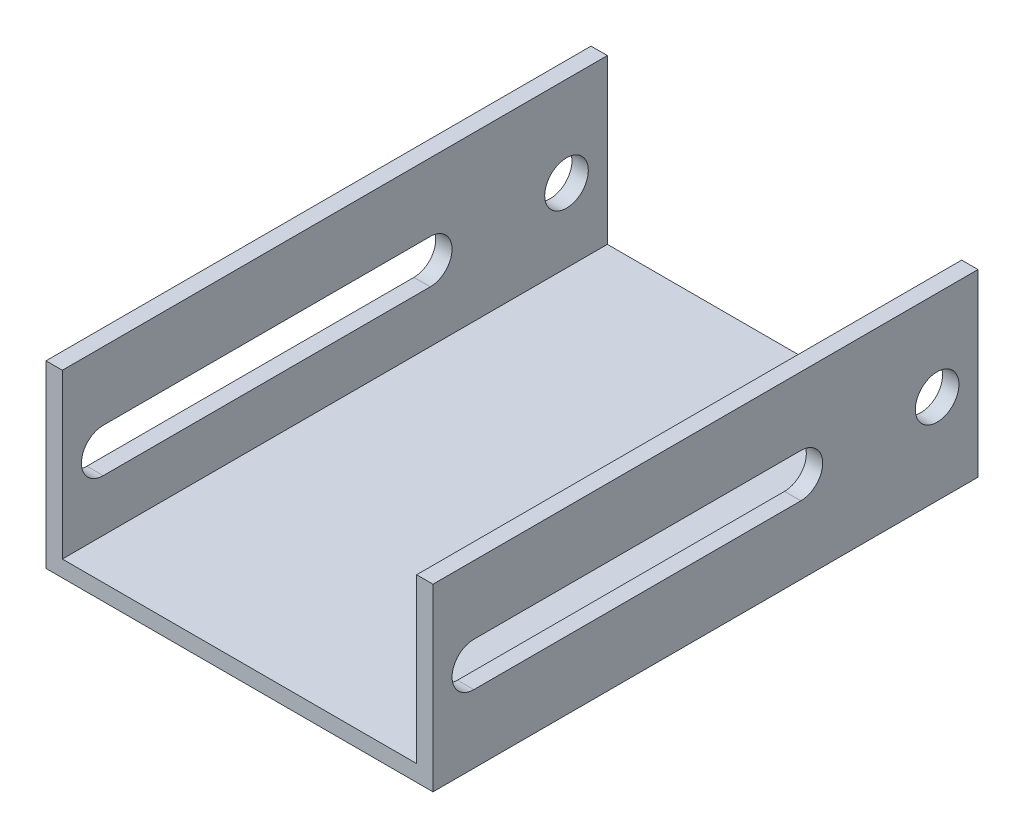
ISO-10303-21;
HEADER;
FILE_DESCRIPTION(('STEP AP214'),'2;1');
FILE_NAME('part.step','',(''),(''),'','','');
FILE_SCHEMA(('AUTOMOTIVE_DESIGN { 1 0 10303 214 1 1 1 1 }'));
ENDSEC;
DATA;
#1=APPLICATION_CONTEXT('core data for automotive mechanical design processes');
#2=APPLICATION_PROTOCOL_DEFINITION('international standard','automotive_design',2000,#1);
#3=PRODUCT_CONTEXT('',#1,'mechanical');
#4=PRODUCT('Part','Part','',(#3));
#5=PRODUCT_RELATED_PRODUCT_CATEGORY('part','',(#4));
#6=PRODUCT_DEFINITION_FORMATION('','',#4);
#7=PRODUCT_DEFINITION_CONTEXT('part definition',#1,'design');
#8=PRODUCT_DEFINITION('design','',#6,#7);
#9=PRODUCT_DEFINITION_SHAPE('','',#8);
#10=(LENGTH_UNIT() NAMED_UNIT(*) SI_UNIT(.MILLI.,.METRE.));
#11=(NAMED_UNIT(*) PLANE_ANGLE_UNIT() SI_UNIT($,.RADIAN.));
#12=(NAMED_UNIT(*) SI_UNIT($,.STERADIAN.) SOLID_ANGLE_UNIT());
#13=UNCERTAINTY_MEASURE_WITH_UNIT(LENGTH_MEASURE(1.E-05),#10,'distance_accuracy_value','');
#14=(GEOMETRIC_REPRESENTATION_CONTEXT(3) GLOBAL_UNCERTAINTY_ASSIGNED_CONTEXT((#13)) GLOBAL_UNIT_ASSIGNED_CONTEXT((#10,
#11,#12)) REPRESENTATION_CONTEXT('',''));
#15=CARTESIAN_POINT('',(0.,0.,0.));
#16=DIRECTION('',(0.,0.,1.));
#17=DIRECTION('',(1.,0.,0.));
#18=AXIS2_PLACEMENT_3D('',#15,#16,#17);
#19=CARTESIAN_POINT('',(0.,3.,0.));
#20=DIRECTION('',(0.,-1.,0.));
#21=DIRECTION('',(0.,0.,-1.));
#22=AXIS2_PLACEMENT_3D('',#19,#20,#21);
#23=PLANE('',#22);
#24=DIRECTION('',(0.,0.,1.));
#25=VECTOR('',#24,1.);
#26=CARTESIAN_POINT('',(32.5,3.,50.));
#27=LINE('',#26,#25);
#28=CARTESIAN_POINT('',(32.5,3.,-50.));
#29=VERTEX_POINT('',#28);
#30=CARTESIAN_POINT('',(32.5,3.,50.));
#31=VERTEX_POINT('',#30);
#32=EDGE_CURVE('E210',#29,#31,#27,.T.);
#33=ORIENTED_EDGE('',*,*,#32,.F.);
#34=DIRECTION('',(-1.,0.,0.));
#35=VECTOR('',#34,1.);
#36=CARTESIAN_POINT('',(-35.5,3.,-50.));
#37=LINE('',#36,#35);
#38=CARTESIAN_POINT('',(-32.5,3.,-50.));
#39=VERTEX_POINT('',#38);
#40=EDGE_CURVE('E261',#29,#39,#37,.T.);
#41=ORIENTED_EDGE('',*,*,#40,.T.);
#42=DIRECTION('',(0.,0.,-1.));
#43=VECTOR('',#42,1.);
#44=CARTESIAN_POINT('',(-32.5,3.,-50.));
#45=LINE('',#44,#43);
#46=CARTESIAN_POINT('',(-32.5,3.,50.));
#47=VERTEX_POINT('',#46);
#48=EDGE_CURVE('E229',#47,#39,#45,.T.);
#49=ORIENTED_EDGE('',*,*,#48,.F.);
#50=DIRECTION('',(1.,0.,0.));
#51=VECTOR('',#50,1.);
#52=CARTESIAN_POINT('',(-35.5,3.,50.));
#53=LINE('',#52,#51);
#54=EDGE_CURVE('E249',#47,#31,#53,.T.);
#55=ORIENTED_EDGE('',*,*,#54,.T.);
#56=EDGE_LOOP('',(#33,#41,#49,#55));
#57=FACE_BOUND('',#56,.T.);
#58=ADVANCED_FACE('F35',(#57),#23,.F.);
#59=CARTESIAN_POINT('',(35.5,3.,50.));
#60=DIRECTION('',(-1.,0.,0.));
#61=DIRECTION('',(0.,0.,1.));
#62=AXIS2_PLACEMENT_3D('',#59,#60,#61);
#63=PLANE('',#62);
#64=DIRECTION('',(0.,0.,1.));
#65=VECTOR('',#64,1.);
#66=CARTESIAN_POINT('',(35.5,20.5,42.5));
#67=LINE('',#66,#65);
#68=CARTESIAN_POINT('',(35.5,20.5,-17.5));
#69=VERTEX_POINT('',#68);
#70=CARTESIAN_POINT('',(35.5,20.5,42.5));
#71=VERTEX_POINT('',#70);
#72=EDGE_CURVE('E163',#69,#71,#67,.T.);
#73=ORIENTED_EDGE('',*,*,#72,.F.);
#74=CARTESIAN_POINT('',(35.5,16.5,-17.5));
#75=DIRECTION('',(1.,0.,0.));
#76=DIRECTION('',(0.,0.,-1.));
#77=AXIS2_PLACEMENT_3D('',#74,#75,#76);
#78=CIRCLE('',#77,4.);
#79=CARTESIAN_POINT('',(35.5,12.5,-17.5));
#80=VERTEX_POINT('',#79);
#81=EDGE_CURVE('E50',#80,#69,#78,.T.);
#82=ORIENTED_EDGE('',*,*,#81,.F.);
#83=DIRECTION('',(0.,0.,-1.));
#84=VECTOR('',#83,1.);
#85=CARTESIAN_POINT('',(35.5,12.5,42.5));
#86=LINE('',#85,#84);
#87=CARTESIAN_POINT('',(35.5,12.5,42.5));
#88=VERTEX_POINT('',#87);
#89=EDGE_CURVE('E170',#88,#80,#86,.T.);
#90=ORIENTED_EDGE('',*,*,#89,.F.);
#91=CARTESIAN_POINT('',(35.5,16.5,42.5));
#92=DIRECTION('',(1.,0.,0.));
#93=DIRECTION('',(0.,0.,-1.));
#94=AXIS2_PLACEMENT_3D('',#91,#92,#93);
#95=CIRCLE('',#94,4.00000000000001);
#96=EDGE_CURVE('E154',#71,#88,#95,.T.);
#97=ORIENTED_EDGE('',*,*,#96,.F.);
#98=EDGE_LOOP('',(#73,#82,#90,#97));
#99=FACE_BOUND('',#98,.T.);
#100=CARTESIAN_POINT('',(35.5,16.5,-42.5));
#101=DIRECTION('',(1.,0.,0.));
#102=DIRECTION('',(0.,0.,-1.));
#103=AXIS2_PLACEMENT_3D('',#100,#101,#102);
#104=CIRCLE('',#103,4.00000000000001);
#105=CARTESIAN_POINT('',(35.5,16.5,-46.5));
#106=VERTEX_POINT('',#105);
#107=EDGE_CURVE('E200',#106,#106,#104,.T.);
#108=ORIENTED_EDGE('',*,*,#107,.F.);
#109=EDGE_LOOP('',(#108));
#110=FACE_BOUND('',#109,.T.);
#111=DIRECTION('',(0.,0.,-1.));
#112=VECTOR('',#111,1.);
#113=CARTESIAN_POINT('',(35.5,0.,50.));
#114=LINE('',#113,#112);
#115=CARTESIAN_POINT('',(35.5,0.,50.));
#116=VERTEX_POINT('',#115);
#117=CARTESIAN_POINT('',(35.5,0.,-50.));
#118=VERTEX_POINT('',#117);
#119=EDGE_CURVE('E258',#116,#118,#114,.T.);
#120=ORIENTED_EDGE('',*,*,#119,.T.);
#121=DIRECTION('',(0.,-1.,0.));
#122=VECTOR('',#121,1.);
#123=CARTESIAN_POINT('',(35.5,3.,-50.));
#124=LINE('',#123,#122);
#125=CARTESIAN_POINT('',(35.5,33.,-50.));
#126=VERTEX_POINT('',#125);
#127=EDGE_CURVE('E268',#126,#118,#124,.T.);
#128=ORIENTED_EDGE('',*,*,#127,.F.);
#129=DIRECTION('',(0.,0.,-1.));
#130=VECTOR('',#129,1.);
#131=CARTESIAN_POINT('',(35.5,33.,50.));
#132=LINE('',#131,#130);
#133=CARTESIAN_POINT('',(35.5,33.,50.));
#134=VERTEX_POINT('',#133);
#135=EDGE_CURVE('E211',#134,#126,#132,.T.);
#136=ORIENTED_EDGE('',*,*,#135,.F.);
#137=DIRECTION('',(0.,-1.,0.));
#138=VECTOR('',#137,1.);
#139=CARTESIAN_POINT('',(35.5,3.,50.));
#140=LINE('',#139,#138);
#141=EDGE_CURVE('E336',#134,#116,#140,.T.);
#142=ORIENTED_EDGE('',*,*,#141,.T.);
#143=EDGE_LOOP('',(#120,#128,#136,#142));
#144=FACE_BOUND('',#143,.T.);
#145=ADVANCED_FACE('F37',(#99,#110,#144),#63,.F.);
#146=CARTESIAN_POINT('',(-35.5,3.,-50.));
#147=DIRECTION('',(0.,0.,1.));
#148=DIRECTION('',(1.,0.,0.));
#149=AXIS2_PLACEMENT_3D('',#146,#147,#148);
#150=PLANE('',#149);
#151=DIRECTION('',(-1.,0.,0.));
#152=VECTOR('',#151,1.);
#153=CARTESIAN_POINT('',(-35.5,0.,-50.));
#154=LINE('',#153,#152);
#155=CARTESIAN_POINT('',(-35.5,0.,-50.));
#156=VERTEX_POINT('',#155);
#157=EDGE_CURVE('E316',#118,#156,#154,.T.);
#158=ORIENTED_EDGE('',*,*,#157,.T.);
#159=DIRECTION('',(0.,-1.,0.));
#160=VECTOR('',#159,1.);
#161=CARTESIAN_POINT('',(-35.5,3.,-50.));
#162=LINE('',#161,#160);
#163=CARTESIAN_POINT('',(-35.5,33.,-50.));
#164=VERTEX_POINT('',#163);
#165=EDGE_CURVE('E319',#164,#156,#162,.T.);
#166=ORIENTED_EDGE('',*,*,#165,.F.);
#167=DIRECTION('',(-1.,0.,0.));
#168=VECTOR('',#167,1.);
#169=CARTESIAN_POINT('',(-35.5,33.,-50.));
#170=LINE('',#169,#168);
#171=CARTESIAN_POINT('',(-32.5,33.,-50.));
#172=VERTEX_POINT('',#171);
#173=EDGE_CURVE('E237',#172,#164,#170,.T.);
#174=ORIENTED_EDGE('',*,*,#173,.F.);
#175=DIRECTION('',(0.,-1.,0.));
#176=VECTOR('',#175,1.);
#177=CARTESIAN_POINT('',(-32.5,33.,-50.));
#178=LINE('',#177,#176);
#179=EDGE_CURVE('E240',#172,#39,#178,.T.);
#180=ORIENTED_EDGE('',*,*,#179,.T.);
#181=ORIENTED_EDGE('',*,*,#40,.F.);
#182=DIRECTION('',(0.,-1.,0.));
#183=VECTOR('',#182,1.);
#184=CARTESIAN_POINT('',(32.5,33.,-50.));
#185=LINE('',#184,#183);
#186=CARTESIAN_POINT('',(32.5,33.,-50.));
#187=VERTEX_POINT('',#186);
#188=EDGE_CURVE('E226',#187,#29,#185,.T.);
#189=ORIENTED_EDGE('',*,*,#188,.F.);
#190=DIRECTION('',(-1.,0.,0.));
#191=VECTOR('',#190,1.);
#192=CARTESIAN_POINT('',(35.5,33.,-50.));
#193=LINE('',#192,#191);
#194=EDGE_CURVE('E214',#126,#187,#193,.T.);
#195=ORIENTED_EDGE('',*,*,#194,.F.);
#196=ORIENTED_EDGE('',*,*,#127,.T.);
#197=EDGE_LOOP('',(#158,#166,#174,#180,#181,#189,#195,#196));
#198=FACE_BOUND('',#197,.T.);
#199=ADVANCED_FACE('F295',(#198),#150,.F.);
#200=CARTESIAN_POINT('',(-35.5,3.,50.));
#201=DIRECTION('',(1.,0.,0.));
#202=DIRECTION('',(0.,0.,-1.));
#203=AXIS2_PLACEMENT_3D('',#200,#201,#202);
#204=PLANE('',#203);
#205=DIRECTION('',(0.,0.,1.));
#206=VECTOR('',#205,1.);
#207=CARTESIAN_POINT('',(-35.5,12.5,42.5));
#208=LINE('',#207,#206);
#209=CARTESIAN_POINT('',(-35.5,12.5,-17.5));
#210=VERTEX_POINT('',#209);
#211=CARTESIAN_POINT('',(-35.5,12.5,42.5));
#212=VERTEX_POINT('',#211);
#213=EDGE_CURVE('E405',#210,#212,#208,.T.);
#214=ORIENTED_EDGE('',*,*,#213,.F.);
#215=CARTESIAN_POINT('',(-35.5,16.5,-17.5));
#216=DIRECTION('',(1.,0.,0.));
#217=DIRECTION('',(0.,0.,-1.));
#218=AXIS2_PLACEMENT_3D('',#215,#216,#217);
#219=CIRCLE('',#218,4.);
#220=CARTESIAN_POINT('',(-35.5,20.5,-17.5));
#221=VERTEX_POINT('',#220);
#222=EDGE_CURVE('E188',#221,#210,#219,.F.);
#223=ORIENTED_EDGE('',*,*,#222,.F.);
#224=DIRECTION('',(0.,0.,-1.));
#225=VECTOR('',#224,1.);
#226=CARTESIAN_POINT('',(-35.5,20.5,42.5));
#227=LINE('',#226,#225);
#228=CARTESIAN_POINT('',(-35.5,20.5,42.5));
#229=VERTEX_POINT('',#228);
#230=EDGE_CURVE('E185',#229,#221,#227,.T.);
#231=ORIENTED_EDGE('',*,*,#230,.F.);
#232=CARTESIAN_POINT('',(-35.5,16.5,42.5));
#233=DIRECTION('',(1.,0.,0.));
#234=DIRECTION('',(0.,0.,-1.));
#235=AXIS2_PLACEMENT_3D('',#232,#233,#234);
#236=CIRCLE('',#235,4.00000000000001);
#237=EDGE_CURVE('E178',#212,#229,#236,.F.);
#238=ORIENTED_EDGE('',*,*,#237,.F.);
#239=EDGE_LOOP('',(#214,#223,#231,#238));
#240=FACE_BOUND('',#239,.T.);
#241=CARTESIAN_POINT('',(-35.5,16.5,-42.5));
#242=DIRECTION('',(1.,0.,0.));
#243=DIRECTION('',(0.,0.,-1.));
#244=AXIS2_PLACEMENT_3D('',#241,#242,#243);
#245=CIRCLE('',#244,4.00000000000001);
#246=CARTESIAN_POINT('',(-35.5,16.5,-46.5));
#247=VERTEX_POINT('',#246);
#248=EDGE_CURVE('E203',#247,#247,#245,.F.);
#249=ORIENTED_EDGE('',*,*,#248,.F.);
#250=EDGE_LOOP('',(#249));
#251=FACE_BOUND('',#250,.T.);
#252=DIRECTION('',(0.,0.,1.));
#253=VECTOR('',#252,1.);
#254=CARTESIAN_POINT('',(-35.5,0.,50.));
#255=LINE('',#254,#253);
#256=CARTESIAN_POINT('',(-35.5,0.,50.));
#257=VERTEX_POINT('',#256);
#258=EDGE_CURVE('E324',#156,#257,#255,.T.);
#259=ORIENTED_EDGE('',*,*,#258,.T.);
#260=DIRECTION('',(0.,-1.,0.));
#261=VECTOR('',#260,1.);
#262=CARTESIAN_POINT('',(-35.5,3.,50.));
#263=LINE('',#262,#261);
#264=CARTESIAN_POINT('',(-35.5,33.,50.));
#265=VERTEX_POINT('',#264);
#266=EDGE_CURVE('E329',#265,#257,#263,.T.);
#267=ORIENTED_EDGE('',*,*,#266,.F.);
#268=DIRECTION('',(0.,0.,1.));
#269=VECTOR('',#268,1.);
#270=CARTESIAN_POINT('',(-35.5,33.,-50.));
#271=LINE('',#270,#269);
#272=EDGE_CURVE('E230',#164,#265,#271,.T.);
#273=ORIENTED_EDGE('',*,*,#272,.F.);
#274=ORIENTED_EDGE('',*,*,#165,.T.);
#275=EDGE_LOOP('',(#259,#267,#273,#274));
#276=FACE_BOUND('',#275,.T.);
#277=ADVANCED_FACE('F307',(#240,#251,#276),#204,.F.);
#278=CARTESIAN_POINT('',(-35.5,3.,50.));
#279=DIRECTION('',(0.,0.,-1.));
#280=DIRECTION('',(-1.,0.,0.));
#281=AXIS2_PLACEMENT_3D('',#278,#279,#280);
#282=PLANE('',#281);
#283=DIRECTION('',(1.,0.,0.));
#284=VECTOR('',#283,1.);
#285=CARTESIAN_POINT('',(-35.5,0.,50.));
#286=LINE('',#285,#284);
#287=EDGE_CURVE('E263',#257,#116,#286,.T.);
#288=ORIENTED_EDGE('',*,*,#287,.T.);
#289=ORIENTED_EDGE('',*,*,#141,.F.);
#290=DIRECTION('',(1.,0.,0.));
#291=VECTOR('',#290,1.);
#292=CARTESIAN_POINT('',(35.5,33.,50.));
#293=LINE('',#292,#291);
#294=CARTESIAN_POINT('',(32.5,33.,50.));
#295=VERTEX_POINT('',#294);
#296=EDGE_CURVE('E218',#295,#134,#293,.T.);
#297=ORIENTED_EDGE('',*,*,#296,.F.);
#298=DIRECTION('',(0.,-1.,0.));
#299=VECTOR('',#298,1.);
#300=CARTESIAN_POINT('',(32.5,33.,50.));
#301=LINE('',#300,#299);
#302=EDGE_CURVE('E221',#295,#31,#301,.T.);
#303=ORIENTED_EDGE('',*,*,#302,.T.);
#304=ORIENTED_EDGE('',*,*,#54,.F.);
#305=DIRECTION('',(0.,-1.,0.));
#306=VECTOR('',#305,1.);
#307=CARTESIAN_POINT('',(-32.5,33.,50.));
#308=LINE('',#307,#306);
#309=CARTESIAN_POINT('',(-32.5,33.,50.));
#310=VERTEX_POINT('',#309);
#311=EDGE_CURVE('E253',#310,#47,#308,.T.);
#312=ORIENTED_EDGE('',*,*,#311,.F.);
#313=DIRECTION('',(1.,0.,0.));
#314=VECTOR('',#313,1.);
#315=CARTESIAN_POINT('',(-35.5,33.,50.));
#316=LINE('',#315,#314);
#317=EDGE_CURVE('E233',#265,#310,#316,.T.);
#318=ORIENTED_EDGE('',*,*,#317,.F.);
#319=ORIENTED_EDGE('',*,*,#266,.T.);
#320=EDGE_LOOP('',(#288,#289,#297,#303,#304,#312,#318,#319));
#321=FACE_BOUND('',#320,.T.);
#322=ADVANCED_FACE('F303',(#321),#282,.F.);
#323=CARTESIAN_POINT('',(0.,0.,0.));
#324=DIRECTION('',(0.,-1.,0.));
#325=DIRECTION('',(0.,0.,-1.));
#326=AXIS2_PLACEMENT_3D('',#323,#324,#325);
#327=PLANE('',#326);
#328=ORIENTED_EDGE('',*,*,#119,.F.);
#329=ORIENTED_EDGE('',*,*,#287,.F.);
#330=ORIENTED_EDGE('',*,*,#258,.F.);
#331=ORIENTED_EDGE('',*,*,#157,.F.);
#332=EDGE_LOOP('',(#328,#329,#330,#331));
#333=FACE_BOUND('',#332,.T.);
#334=ADVANCED_FACE('F300',(#333),#327,.T.);
#335=CARTESIAN_POINT('',(-32.5,33.,-50.));
#336=DIRECTION('',(-1.,0.,0.));
#337=DIRECTION('',(0.,0.,1.));
#338=AXIS2_PLACEMENT_3D('',#335,#336,#337);
#339=PLANE('',#338);
#340=DIRECTION('',(0.,0.,-1.));
#341=VECTOR('',#340,1.);
#342=CARTESIAN_POINT('',(-32.5,20.5,-50.));
#343=LINE('',#342,#341);
#344=CARTESIAN_POINT('',(-32.5,20.5,42.5));
#345=VERTEX_POINT('',#344);
#346=CARTESIAN_POINT('',(-32.5,20.5,-17.5));
#347=VERTEX_POINT('',#346);
#348=EDGE_CURVE('E187',#345,#347,#343,.T.);
#349=ORIENTED_EDGE('',*,*,#348,.T.);
#350=CARTESIAN_POINT('',(-32.5,16.5,-17.5));
#351=DIRECTION('',(-1.,0.,0.));
#352=DIRECTION('',(0.,0.,1.));
#353=AXIS2_PLACEMENT_3D('',#350,#351,#352);
#354=CIRCLE('',#353,4.);
#355=CARTESIAN_POINT('',(-32.5,12.5,-17.5));
#356=VERTEX_POINT('',#355);
#357=EDGE_CURVE('E197',#347,#356,#354,.T.);
#358=ORIENTED_EDGE('',*,*,#357,.T.);
#359=DIRECTION('',(0.,0.,1.));
#360=VECTOR('',#359,1.);
#361=CARTESIAN_POINT('',(-32.5,12.5,-50.));
#362=LINE('',#361,#360);
#363=CARTESIAN_POINT('',(-32.5,12.5,42.5));
#364=VERTEX_POINT('',#363);
#365=EDGE_CURVE('E194',#356,#364,#362,.T.);
#366=ORIENTED_EDGE('',*,*,#365,.T.);
#367=CARTESIAN_POINT('',(-32.5,16.5,42.5));
#368=DIRECTION('',(-1.,0.,0.));
#369=DIRECTION('',(0.,0.,1.));
#370=AXIS2_PLACEMENT_3D('',#367,#368,#369);
#371=CIRCLE('',#370,4.00000000000001);
#372=EDGE_CURVE('E191',#364,#345,#371,.T.);
#373=ORIENTED_EDGE('',*,*,#372,.T.);
#374=EDGE_LOOP('',(#349,#358,#366,#373));
#375=FACE_BOUND('',#374,.T.);
#376=CARTESIAN_POINT('',(-32.5,16.5,-42.5));
#377=DIRECTION('',(-1.,0.,0.));
#378=DIRECTION('',(0.,0.,1.));
#379=AXIS2_PLACEMENT_3D('',#376,#377,#378);
#380=CIRCLE('',#379,4.00000000000001);
#381=CARTESIAN_POINT('',(-32.5,16.5,-38.5));
#382=VERTEX_POINT('',#381);
#383=EDGE_CURVE('E207',#382,#382,#380,.T.);
#384=ORIENTED_EDGE('',*,*,#383,.T.);
#385=EDGE_LOOP('',(#384));
#386=FACE_BOUND('',#385,.T.);
#387=ORIENTED_EDGE('',*,*,#48,.T.);
#388=ORIENTED_EDGE('',*,*,#179,.F.);
#389=DIRECTION('',(0.,0.,-1.));
#390=VECTOR('',#389,1.);
#391=CARTESIAN_POINT('',(-32.5,33.,-50.));
#392=LINE('',#391,#390);
#393=EDGE_CURVE('E235',#310,#172,#392,.T.);
#394=ORIENTED_EDGE('',*,*,#393,.F.);
#395=ORIENTED_EDGE('',*,*,#311,.T.);
#396=EDGE_LOOP('',(#387,#388,#394,#395));
#397=FACE_BOUND('',#396,.T.);
#398=ADVANCED_FACE('F298',(#375,#386,#397),#339,.F.);
#399=CARTESIAN_POINT('',(0.,33.,0.));
#400=DIRECTION('',(0.,1.,0.));
#401=DIRECTION('',(0.,0.,1.));
#402=AXIS2_PLACEMENT_3D('',#399,#400,#401);
#403=PLANE('',#402);
#404=ORIENTED_EDGE('',*,*,#272,.T.);
#405=ORIENTED_EDGE('',*,*,#317,.T.);
#406=ORIENTED_EDGE('',*,*,#393,.T.);
#407=ORIENTED_EDGE('',*,*,#173,.T.);
#408=EDGE_LOOP('',(#404,#405,#406,#407));
#409=FACE_BOUND('',#408,.T.);
#410=ADVANCED_FACE('F344',(#409),#403,.T.);
#411=CARTESIAN_POINT('',(32.5,33.,50.));
#412=DIRECTION('',(1.,0.,0.));
#413=DIRECTION('',(0.,0.,-1.));
#414=AXIS2_PLACEMENT_3D('',#411,#412,#413);
#415=PLANE('',#414);
#416=DIRECTION('',(0.,0.,-1.));
#417=VECTOR('',#416,1.);
#418=CARTESIAN_POINT('',(32.5,12.5,50.));
#419=LINE('',#418,#417);
#420=CARTESIAN_POINT('',(32.5,12.5,42.5));
#421=VERTEX_POINT('',#420);
#422=CARTESIAN_POINT('',(32.5,12.5,-17.5));
#423=VERTEX_POINT('',#422);
#424=EDGE_CURVE('E43',#421,#423,#419,.T.);
#425=ORIENTED_EDGE('',*,*,#424,.T.);
#426=CARTESIAN_POINT('',(32.5,16.5,-17.5));
#427=DIRECTION('',(1.,0.,0.));
#428=DIRECTION('',(0.,0.,-1.));
#429=AXIS2_PLACEMENT_3D('',#426,#427,#428);
#430=CIRCLE('',#429,4.);
#431=CARTESIAN_POINT('',(32.5,20.5,-17.5));
#432=VERTEX_POINT('',#431);
#433=EDGE_CURVE('E11',#423,#432,#430,.T.);
#434=ORIENTED_EDGE('',*,*,#433,.T.);
#435=DIRECTION('',(0.,0.,1.));
#436=VECTOR('',#435,1.);
#437=CARTESIAN_POINT('',(32.5,20.5,50.));
#438=LINE('',#437,#436);
#439=CARTESIAN_POINT('',(32.5,20.5,42.5));
#440=VERTEX_POINT('',#439);
#441=EDGE_CURVE('E266',#432,#440,#438,.T.);
#442=ORIENTED_EDGE('',*,*,#441,.T.);
#443=CARTESIAN_POINT('',(32.5,16.5,42.5));
#444=DIRECTION('',(1.,0.,0.));
#445=DIRECTION('',(0.,0.,-1.));
#446=AXIS2_PLACEMENT_3D('',#443,#444,#445);
#447=CIRCLE('',#446,4.00000000000001);
#448=EDGE_CURVE('E157',#440,#421,#447,.T.);
#449=ORIENTED_EDGE('',*,*,#448,.T.);
#450=EDGE_LOOP('',(#425,#434,#442,#449));
#451=FACE_BOUND('',#450,.T.);
#452=CARTESIAN_POINT('',(32.5,16.5,-42.5));
#453=DIRECTION('',(1.,0.,0.));
#454=DIRECTION('',(0.,0.,-1.));
#455=AXIS2_PLACEMENT_3D('',#452,#453,#454);
#456=CIRCLE('',#455,4.00000000000001);
#457=CARTESIAN_POINT('',(32.5,16.5,-46.5));
#458=VERTEX_POINT('',#457);
#459=EDGE_CURVE('E206',#458,#458,#456,.T.);
#460=ORIENTED_EDGE('',*,*,#459,.T.);
#461=EDGE_LOOP('',(#460));
#462=FACE_BOUND('',#461,.T.);
#463=ORIENTED_EDGE('',*,*,#32,.T.);
#464=ORIENTED_EDGE('',*,*,#302,.F.);
#465=DIRECTION('',(0.,0.,1.));
#466=VECTOR('',#465,1.);
#467=CARTESIAN_POINT('',(32.5,33.,50.));
#468=LINE('',#467,#466);
#469=EDGE_CURVE('E216',#187,#295,#468,.T.);
#470=ORIENTED_EDGE('',*,*,#469,.F.);
#471=ORIENTED_EDGE('',*,*,#188,.T.);
#472=EDGE_LOOP('',(#463,#464,#470,#471));
#473=FACE_BOUND('',#472,.T.);
#474=ADVANCED_FACE('F271',(#451,#462,#473),#415,.F.);
#475=CARTESIAN_POINT('',(0.,33.,0.));
#476=DIRECTION('',(0.,1.,0.));
#477=DIRECTION('',(0.,0.,1.));
#478=AXIS2_PLACEMENT_3D('',#475,#476,#477);
#479=PLANE('',#478);
#480=ORIENTED_EDGE('',*,*,#135,.T.);
#481=ORIENTED_EDGE('',*,*,#194,.T.);
#482=ORIENTED_EDGE('',*,*,#469,.T.);
#483=ORIENTED_EDGE('',*,*,#296,.T.);
#484=EDGE_LOOP('',(#480,#481,#482,#483));
#485=FACE_BOUND('',#484,.T.);
#486=ADVANCED_FACE('F355',(#485),#479,.T.);
#487=CARTESIAN_POINT('',(-103.968971074495,16.5,-42.5));
#488=DIRECTION('',(1.,0.,0.));
#489=DIRECTION('',(0.,0.,-1.));
#490=AXIS2_PLACEMENT_3D('',#487,#488,#489);
#491=CYLINDRICAL_SURFACE('',#490,4.00000000000001);
#492=ORIENTED_EDGE('',*,*,#107,.T.);
#493=EDGE_LOOP('',(#492));
#494=FACE_BOUND('',#493,.T.);
#495=ORIENTED_EDGE('',*,*,#459,.F.);
#496=EDGE_LOOP('',(#495));
#497=FACE_BOUND('',#496,.T.);
#498=ADVANCED_FACE('F359',(#494,#497),#491,.F.);
#499=ORIENTED_EDGE('',*,*,#248,.T.);
#500=EDGE_LOOP('',(#499));
#501=FACE_BOUND('',#500,.T.);
#502=ORIENTED_EDGE('',*,*,#383,.F.);
#503=EDGE_LOOP('',(#502));
#504=FACE_BOUND('',#503,.T.);
#505=ADVANCED_FACE('F365',(#501,#504),#491,.F.);
#506=CARTESIAN_POINT('',(-103.968971074495,20.5,42.5));
#507=DIRECTION('',(0.,1.,0.));
#508=DIRECTION('',(0.,0.,1.));
#509=AXIS2_PLACEMENT_3D('',#506,#507,#508);
#510=PLANE('',#509);
#511=DIRECTION('',(1.,0.,0.));
#512=VECTOR('',#511,1.);
#513=CARTESIAN_POINT('',(-103.968971074495,20.5,-17.5));
#514=LINE('',#513,#512);
#515=EDGE_CURVE('E165',#432,#69,#514,.T.);
#516=ORIENTED_EDGE('',*,*,#515,.T.);
#517=ORIENTED_EDGE('',*,*,#72,.T.);
#518=DIRECTION('',(1.,0.,0.));
#519=VECTOR('',#518,1.);
#520=CARTESIAN_POINT('',(-103.968971074495,20.5,42.5));
#521=LINE('',#520,#519);
#522=EDGE_CURVE('E149',#440,#71,#521,.T.);
#523=ORIENTED_EDGE('',*,*,#522,.F.);
#524=ORIENTED_EDGE('',*,*,#441,.F.);
#525=EDGE_LOOP('',(#516,#517,#523,#524));
#526=FACE_BOUND('',#525,.T.);
#527=ADVANCED_FACE('F164',(#526),#510,.F.);
#528=CARTESIAN_POINT('',(-103.968971074495,16.5,42.5));
#529=DIRECTION('',(1.,0.,0.));
#530=DIRECTION('',(0.,0.,-1.));
#531=AXIS2_PLACEMENT_3D('',#528,#529,#530);
#532=CYLINDRICAL_SURFACE('',#531,4.00000000000001);
#533=ORIENTED_EDGE('',*,*,#522,.T.);
#534=ORIENTED_EDGE('',*,*,#96,.T.);
#535=DIRECTION('',(1.,0.,0.));
#536=VECTOR('',#535,1.);
#537=CARTESIAN_POINT('',(-103.968971074495,12.5,42.5));
#538=LINE('',#537,#536);
#539=EDGE_CURVE('E182',#421,#88,#538,.T.);
#540=ORIENTED_EDGE('',*,*,#539,.F.);
#541=ORIENTED_EDGE('',*,*,#448,.F.);
#542=EDGE_LOOP('',(#533,#534,#540,#541));
#543=FACE_BOUND('',#542,.T.);
#544=ADVANCED_FACE('F151',(#543),#532,.F.);
#545=CARTESIAN_POINT('',(-103.968971074495,12.5,42.5));
#546=DIRECTION('',(0.,-1.,0.));
#547=DIRECTION('',(0.,0.,-1.));
#548=AXIS2_PLACEMENT_3D('',#545,#546,#547);
#549=PLANE('',#548);
#550=ORIENTED_EDGE('',*,*,#539,.T.);
#551=ORIENTED_EDGE('',*,*,#89,.T.);
#552=DIRECTION('',(1.,0.,0.));
#553=VECTOR('',#552,1.);
#554=CARTESIAN_POINT('',(-103.968971074495,12.5,-17.5));
#555=LINE('',#554,#553);
#556=EDGE_CURVE('E179',#423,#80,#555,.T.);
#557=ORIENTED_EDGE('',*,*,#556,.F.);
#558=ORIENTED_EDGE('',*,*,#424,.F.);
#559=EDGE_LOOP('',(#550,#551,#557,#558));
#560=FACE_BOUND('',#559,.T.);
#561=ADVANCED_FACE('F275',(#560),#549,.F.);
#562=CARTESIAN_POINT('',(-103.968971074495,16.5,-17.5));
#563=DIRECTION('',(1.,0.,0.));
#564=DIRECTION('',(0.,0.,-1.));
#565=AXIS2_PLACEMENT_3D('',#562,#563,#564);
#566=CYLINDRICAL_SURFACE('',#565,4.);
#567=ORIENTED_EDGE('',*,*,#556,.T.);
#568=ORIENTED_EDGE('',*,*,#81,.T.);
#569=ORIENTED_EDGE('',*,*,#515,.F.);
#570=ORIENTED_EDGE('',*,*,#433,.F.);
#571=EDGE_LOOP('',(#567,#568,#569,#570));
#572=FACE_BOUND('',#571,.T.);
#573=ADVANCED_FACE('F276',(#572),#566,.F.);
#574=EDGE_CURVE('E160',#221,#347,#514,.T.);
#575=ORIENTED_EDGE('',*,*,#574,.F.);
#576=ORIENTED_EDGE('',*,*,#222,.T.);
#577=EDGE_CURVE('E175',#210,#356,#555,.T.);
#578=ORIENTED_EDGE('',*,*,#577,.T.);
#579=ORIENTED_EDGE('',*,*,#357,.F.);
#580=EDGE_LOOP('',(#575,#576,#578,#579));
#581=FACE_BOUND('',#580,.T.);
#582=ADVANCED_FACE('F278',(#581),#566,.F.);
#583=ORIENTED_EDGE('',*,*,#577,.F.);
#584=ORIENTED_EDGE('',*,*,#213,.T.);
#585=EDGE_CURVE('E180',#212,#364,#538,.T.);
#586=ORIENTED_EDGE('',*,*,#585,.T.);
#587=ORIENTED_EDGE('',*,*,#365,.F.);
#588=EDGE_LOOP('',(#583,#584,#586,#587));
#589=FACE_BOUND('',#588,.T.);
#590=ADVANCED_FACE('F284',(#589),#549,.F.);
#591=ORIENTED_EDGE('',*,*,#585,.F.);
#592=ORIENTED_EDGE('',*,*,#237,.T.);
#593=EDGE_CURVE('E58',#229,#345,#521,.T.);
#594=ORIENTED_EDGE('',*,*,#593,.T.);
#595=ORIENTED_EDGE('',*,*,#372,.F.);
#596=EDGE_LOOP('',(#591,#592,#594,#595));
#597=FACE_BOUND('',#596,.T.);
#598=ADVANCED_FACE('F390',(#597),#532,.F.);
#599=ORIENTED_EDGE('',*,*,#593,.F.);
#600=ORIENTED_EDGE('',*,*,#230,.T.);
#601=ORIENTED_EDGE('',*,*,#574,.T.);
#602=ORIENTED_EDGE('',*,*,#348,.F.);
#603=EDGE_LOOP('',(#599,#600,#601,#602));
#604=FACE_BOUND('',#603,.T.);
#605=ADVANCED_FACE('F383',(#604),#510,.F.);
#606=CLOSED_SHELL('',(#58,#145,#199,#277,#322,#334,#398,#410,#474,#486,#498,#505,#527,#544,#561,
#573,#582,#590,#598,#605));
#607=MANIFOLD_SOLID_BREP('B2',#606);
#608=ADVANCED_BREP_SHAPE_REPRESENTATION('',(#18,#607),#14);
#609=SHAPE_DEFINITION_REPRESENTATION(#9,#608);
ENDSEC;
END-ISO-10303-21;
